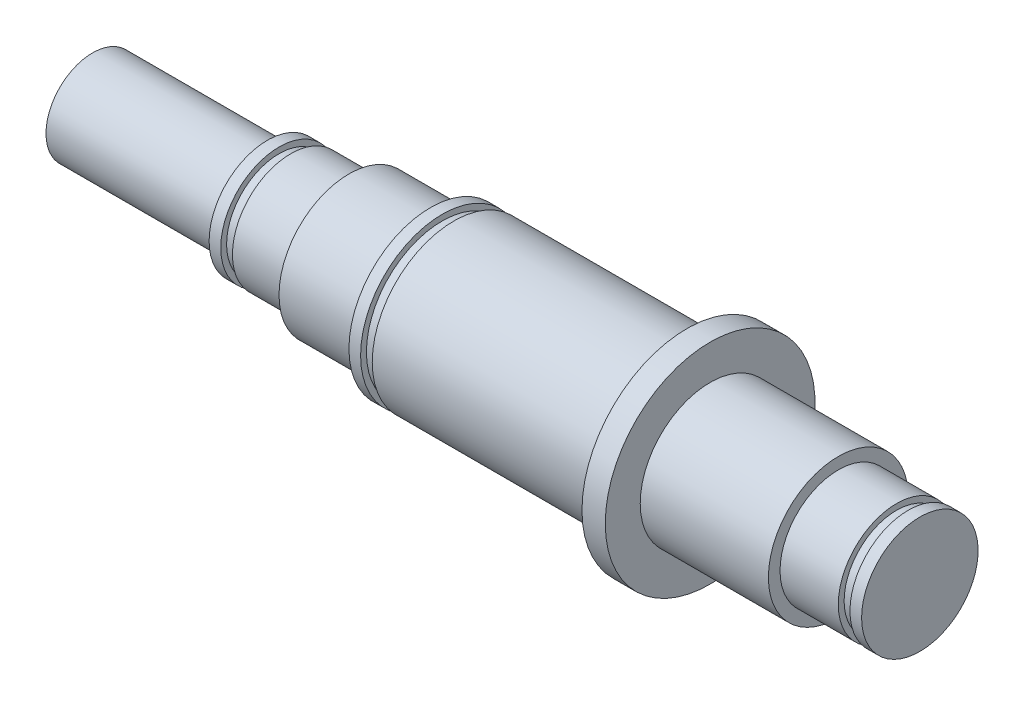
ISO-10303-21;
HEADER;
FILE_DESCRIPTION(('STEP AP214'),'2;1');
FILE_NAME('part.step','',(''),(''),'','','');
FILE_SCHEMA(('AUTOMOTIVE_DESIGN { 1 0 10303 214 1 1 1 1 }'));
ENDSEC;
DATA;
#1=APPLICATION_CONTEXT('core data for automotive mechanical design processes');
#2=APPLICATION_PROTOCOL_DEFINITION('international standard','automotive_design',2000,#1);
#3=PRODUCT_CONTEXT('',#1,'mechanical');
#4=PRODUCT('Part','Part','',(#3));
#5=PRODUCT_RELATED_PRODUCT_CATEGORY('part','',(#4));
#6=PRODUCT_DEFINITION_FORMATION('','',#4);
#7=PRODUCT_DEFINITION_CONTEXT('part definition',#1,'design');
#8=PRODUCT_DEFINITION('design','',#6,#7);
#9=PRODUCT_DEFINITION_SHAPE('','',#8);
#10=(LENGTH_UNIT() NAMED_UNIT(*) SI_UNIT(.MILLI.,.METRE.));
#11=(NAMED_UNIT(*) PLANE_ANGLE_UNIT() SI_UNIT($,.RADIAN.));
#12=(NAMED_UNIT(*) SI_UNIT($,.STERADIAN.) SOLID_ANGLE_UNIT());
#13=UNCERTAINTY_MEASURE_WITH_UNIT(LENGTH_MEASURE(1.E-05),#10,'distance_accuracy_value','');
#14=(GEOMETRIC_REPRESENTATION_CONTEXT(3) GLOBAL_UNCERTAINTY_ASSIGNED_CONTEXT((#13)) GLOBAL_UNIT_ASSIGNED_CONTEXT((#10,
#11,#12)) REPRESENTATION_CONTEXT('',''));
#15=CARTESIAN_POINT('',(0.,0.,0.));
#16=DIRECTION('',(0.,0.,1.));
#17=DIRECTION('',(1.,0.,0.));
#18=AXIS2_PLACEMENT_3D('',#15,#16,#17);
#19=CARTESIAN_POINT('',(0.,0.,0.));
#20=DIRECTION('',(1.,0.,0.));
#21=DIRECTION('',(0.,0.,-1.));
#22=AXIS2_PLACEMENT_3D('',#19,#20,#21);
#23=PLANE('',#22);
#24=CARTESIAN_POINT('',(0.,0.,0.));
#25=DIRECTION('',(-1.,0.,0.));
#26=DIRECTION('',(0.,0.,1.));
#27=AXIS2_PLACEMENT_3D('',#24,#25,#26);
#28=CIRCLE('',#27,4.);
#29=CARTESIAN_POINT('',(0.,0.,4.));
#30=VERTEX_POINT('',#29);
#31=EDGE_CURVE('E10',#30,#30,#28,.T.);
#32=ORIENTED_EDGE('',*,*,#31,.T.);
#33=EDGE_LOOP('',(#32));
#34=FACE_BOUND('',#33,.T.);
#35=ADVANCED_FACE('F32',(#34),#23,.F.);
#36=CARTESIAN_POINT('',(0.,0.,0.));
#37=DIRECTION('',(-1.,0.,0.));
#38=DIRECTION('',(0.,0.,1.));
#39=AXIS2_PLACEMENT_3D('',#36,#37,#38);
#40=CYLINDRICAL_SURFACE('',#39,4.);
#41=ORIENTED_EDGE('',*,*,#31,.F.);
#42=EDGE_LOOP('',(#41));
#43=FACE_BOUND('',#42,.T.);
#44=CARTESIAN_POINT('',(15.,0.,0.));
#45=DIRECTION('',(-1.,0.,0.));
#46=DIRECTION('',(0.,0.,1.));
#47=AXIS2_PLACEMENT_3D('',#44,#45,#46);
#48=CIRCLE('',#47,4.);
#49=CARTESIAN_POINT('',(15.,0.,4.));
#50=VERTEX_POINT('',#49);
#51=EDGE_CURVE('E38',#50,#50,#48,.T.);
#52=ORIENTED_EDGE('',*,*,#51,.T.);
#53=EDGE_LOOP('',(#52));
#54=FACE_BOUND('',#53,.T.);
#55=ADVANCED_FACE('F130',(#43,#54),#40,.T.);
#56=CARTESIAN_POINT('',(15.,4.,0.));
#57=DIRECTION('',(1.,0.,0.));
#58=DIRECTION('',(0.,0.,-1.));
#59=AXIS2_PLACEMENT_3D('',#56,#57,#58);
#60=PLANE('',#59);
#61=ORIENTED_EDGE('',*,*,#51,.F.);
#62=EDGE_LOOP('',(#61));
#63=FACE_BOUND('',#62,.T.);
#64=CARTESIAN_POINT('',(15.,0.,0.));
#65=DIRECTION('',(-1.,0.,0.));
#66=DIRECTION('',(0.,0.,1.));
#67=AXIS2_PLACEMENT_3D('',#64,#65,#66);
#68=CIRCLE('',#67,5.);
#69=CARTESIAN_POINT('',(15.,0.,5.));
#70=VERTEX_POINT('',#69);
#71=EDGE_CURVE('E42',#70,#70,#68,.T.);
#72=ORIENTED_EDGE('',*,*,#71,.T.);
#73=EDGE_LOOP('',(#72));
#74=FACE_BOUND('',#73,.T.);
#75=ADVANCED_FACE('F134',(#63,#74),#60,.F.);
#76=CARTESIAN_POINT('',(0.,0.,0.));
#77=DIRECTION('',(-1.,0.,0.));
#78=DIRECTION('',(0.,0.,1.));
#79=AXIS2_PLACEMENT_3D('',#76,#77,#78);
#80=CYLINDRICAL_SURFACE('',#79,5.);
#81=ORIENTED_EDGE('',*,*,#71,.F.);
#82=EDGE_LOOP('',(#81));
#83=FACE_BOUND('',#82,.T.);
#84=CARTESIAN_POINT('',(16.,0.,0.));
#85=DIRECTION('',(-1.,0.,0.));
#86=DIRECTION('',(0.,0.,1.));
#87=AXIS2_PLACEMENT_3D('',#84,#85,#86);
#88=CIRCLE('',#87,5.);
#89=CARTESIAN_POINT('',(16.,0.,5.));
#90=VERTEX_POINT('',#89);
#91=EDGE_CURVE('E46',#90,#90,#88,.T.);
#92=ORIENTED_EDGE('',*,*,#91,.T.);
#93=EDGE_LOOP('',(#92));
#94=FACE_BOUND('',#93,.T.);
#95=ADVANCED_FACE('F139',(#83,#94),#80,.T.);
#96=CARTESIAN_POINT('',(16.,5.,0.));
#97=DIRECTION('',(-1.,0.,0.));
#98=DIRECTION('',(0.,0.,1.));
#99=AXIS2_PLACEMENT_3D('',#96,#97,#98);
#100=PLANE('',#99);
#101=ORIENTED_EDGE('',*,*,#91,.F.);
#102=EDGE_LOOP('',(#101));
#103=FACE_BOUND('',#102,.T.);
#104=CARTESIAN_POINT('',(16.,0.,0.));
#105=DIRECTION('',(-1.,0.,0.));
#106=DIRECTION('',(0.,0.,1.));
#107=AXIS2_PLACEMENT_3D('',#104,#105,#106);
#108=CIRCLE('',#107,4.5);
#109=CARTESIAN_POINT('',(16.,0.,4.5));
#110=VERTEX_POINT('',#109);
#111=EDGE_CURVE('E51',#110,#110,#108,.T.);
#112=ORIENTED_EDGE('',*,*,#111,.T.);
#113=EDGE_LOOP('',(#112));
#114=FACE_BOUND('',#113,.T.);
#115=ADVANCED_FACE('F145',(#103,#114),#100,.F.);
#116=CARTESIAN_POINT('',(0.,0.,0.));
#117=DIRECTION('',(-1.,0.,0.));
#118=DIRECTION('',(0.,0.,1.));
#119=AXIS2_PLACEMENT_3D('',#116,#117,#118);
#120=CYLINDRICAL_SURFACE('',#119,4.5);
#121=ORIENTED_EDGE('',*,*,#111,.F.);
#122=EDGE_LOOP('',(#121));
#123=FACE_BOUND('',#122,.T.);
#124=CARTESIAN_POINT('',(17.,0.,0.));
#125=DIRECTION('',(-1.,0.,0.));
#126=DIRECTION('',(0.,0.,1.));
#127=AXIS2_PLACEMENT_3D('',#124,#125,#126);
#128=CIRCLE('',#127,4.5);
#129=CARTESIAN_POINT('',(17.,0.,4.5));
#130=VERTEX_POINT('',#129);
#131=EDGE_CURVE('E54',#130,#130,#128,.T.);
#132=ORIENTED_EDGE('',*,*,#131,.T.);
#133=EDGE_LOOP('',(#132));
#134=FACE_BOUND('',#133,.T.);
#135=ADVANCED_FACE('F149',(#123,#134),#120,.T.);
#136=CARTESIAN_POINT('',(17.,4.5,0.));
#137=DIRECTION('',(1.,0.,0.));
#138=DIRECTION('',(0.,0.,-1.));
#139=AXIS2_PLACEMENT_3D('',#136,#137,#138);
#140=PLANE('',#139);
#141=ORIENTED_EDGE('',*,*,#131,.F.);
#142=EDGE_LOOP('',(#141));
#143=FACE_BOUND('',#142,.T.);
#144=CARTESIAN_POINT('',(17.,0.,0.));
#145=DIRECTION('',(-1.,0.,0.));
#146=DIRECTION('',(0.,0.,1.));
#147=AXIS2_PLACEMENT_3D('',#144,#145,#146);
#148=CIRCLE('',#147,5.);
#149=CARTESIAN_POINT('',(17.,0.,5.));
#150=VERTEX_POINT('',#149);
#151=EDGE_CURVE('E57',#150,#150,#148,.T.);
#152=ORIENTED_EDGE('',*,*,#151,.T.);
#153=EDGE_LOOP('',(#152));
#154=FACE_BOUND('',#153,.T.);
#155=ADVANCED_FACE('F153',(#143,#154),#140,.F.);
#156=CARTESIAN_POINT('',(0.,0.,0.));
#157=DIRECTION('',(-1.,0.,0.));
#158=DIRECTION('',(0.,0.,1.));
#159=AXIS2_PLACEMENT_3D('',#156,#157,#158);
#160=CYLINDRICAL_SURFACE('',#159,5.);
#161=ORIENTED_EDGE('',*,*,#151,.F.);
#162=EDGE_LOOP('',(#161));
#163=FACE_BOUND('',#162,.T.);
#164=CARTESIAN_POINT('',(22.,0.,0.));
#165=DIRECTION('',(-1.,0.,0.));
#166=DIRECTION('',(0.,0.,1.));
#167=AXIS2_PLACEMENT_3D('',#164,#165,#166);
#168=CIRCLE('',#167,5.);
#169=CARTESIAN_POINT('',(22.,0.,5.));
#170=VERTEX_POINT('',#169);
#171=EDGE_CURVE('E60',#170,#170,#168,.T.);
#172=ORIENTED_EDGE('',*,*,#171,.T.);
#173=EDGE_LOOP('',(#172));
#174=FACE_BOUND('',#173,.T.);
#175=ADVANCED_FACE('F157',(#163,#174),#160,.T.);
#176=CARTESIAN_POINT('',(22.,5.,0.));
#177=DIRECTION('',(1.,0.,0.));
#178=DIRECTION('',(0.,0.,-1.));
#179=AXIS2_PLACEMENT_3D('',#176,#177,#178);
#180=PLANE('',#179);
#181=ORIENTED_EDGE('',*,*,#171,.F.);
#182=EDGE_LOOP('',(#181));
#183=FACE_BOUND('',#182,.T.);
#184=CARTESIAN_POINT('',(22.,0.,0.));
#185=DIRECTION('',(-1.,0.,0.));
#186=DIRECTION('',(0.,0.,1.));
#187=AXIS2_PLACEMENT_3D('',#184,#185,#186);
#188=CIRCLE('',#187,6.);
#189=CARTESIAN_POINT('',(22.,0.,6.));
#190=VERTEX_POINT('',#189);
#191=EDGE_CURVE('E63',#190,#190,#188,.T.);
#192=ORIENTED_EDGE('',*,*,#191,.T.);
#193=EDGE_LOOP('',(#192));
#194=FACE_BOUND('',#193,.T.);
#195=ADVANCED_FACE('F161',(#183,#194),#180,.F.);
#196=CARTESIAN_POINT('',(0.,0.,0.));
#197=DIRECTION('',(-1.,0.,0.));
#198=DIRECTION('',(0.,0.,1.));
#199=AXIS2_PLACEMENT_3D('',#196,#197,#198);
#200=CYLINDRICAL_SURFACE('',#199,6.);
#201=ORIENTED_EDGE('',*,*,#191,.F.);
#202=EDGE_LOOP('',(#201));
#203=FACE_BOUND('',#202,.T.);
#204=CARTESIAN_POINT('',(29.,0.,0.));
#205=DIRECTION('',(-1.,0.,0.));
#206=DIRECTION('',(0.,0.,1.));
#207=AXIS2_PLACEMENT_3D('',#204,#205,#206);
#208=CIRCLE('',#207,6.);
#209=CARTESIAN_POINT('',(29.,0.,6.));
#210=VERTEX_POINT('',#209);
#211=EDGE_CURVE('E66',#210,#210,#208,.T.);
#212=ORIENTED_EDGE('',*,*,#211,.T.);
#213=EDGE_LOOP('',(#212));
#214=FACE_BOUND('',#213,.T.);
#215=ADVANCED_FACE('F165',(#203,#214),#200,.T.);
#216=CARTESIAN_POINT('',(29.,6.,0.));
#217=DIRECTION('',(1.,0.,0.));
#218=DIRECTION('',(0.,0.,-1.));
#219=AXIS2_PLACEMENT_3D('',#216,#217,#218);
#220=PLANE('',#219);
#221=ORIENTED_EDGE('',*,*,#211,.F.);
#222=EDGE_LOOP('',(#221));
#223=FACE_BOUND('',#222,.T.);
#224=CARTESIAN_POINT('',(29.,0.,0.));
#225=DIRECTION('',(-1.,0.,0.));
#226=DIRECTION('',(0.,0.,1.));
#227=AXIS2_PLACEMENT_3D('',#224,#225,#226);
#228=CIRCLE('',#227,7.);
#229=CARTESIAN_POINT('',(29.,0.,7.));
#230=VERTEX_POINT('',#229);
#231=EDGE_CURVE('E69',#230,#230,#228,.T.);
#232=ORIENTED_EDGE('',*,*,#231,.T.);
#233=EDGE_LOOP('',(#232));
#234=FACE_BOUND('',#233,.T.);
#235=ADVANCED_FACE('F169',(#223,#234),#220,.F.);
#236=CARTESIAN_POINT('',(0.,0.,0.));
#237=DIRECTION('',(-1.,0.,0.));
#238=DIRECTION('',(0.,0.,1.));
#239=AXIS2_PLACEMENT_3D('',#236,#237,#238);
#240=CYLINDRICAL_SURFACE('',#239,7.);
#241=ORIENTED_EDGE('',*,*,#231,.F.);
#242=EDGE_LOOP('',(#241));
#243=FACE_BOUND('',#242,.T.);
#244=CARTESIAN_POINT('',(30.,0.,0.));
#245=DIRECTION('',(-1.,0.,0.));
#246=DIRECTION('',(0.,0.,1.));
#247=AXIS2_PLACEMENT_3D('',#244,#245,#246);
#248=CIRCLE('',#247,7.);
#249=CARTESIAN_POINT('',(30.,0.,7.));
#250=VERTEX_POINT('',#249);
#251=EDGE_CURVE('E72',#250,#250,#248,.T.);
#252=ORIENTED_EDGE('',*,*,#251,.T.);
#253=EDGE_LOOP('',(#252));
#254=FACE_BOUND('',#253,.T.);
#255=ADVANCED_FACE('F173',(#243,#254),#240,.T.);
#256=CARTESIAN_POINT('',(30.,7.,0.));
#257=DIRECTION('',(-1.,0.,0.));
#258=DIRECTION('',(0.,0.,1.));
#259=AXIS2_PLACEMENT_3D('',#256,#257,#258);
#260=PLANE('',#259);
#261=ORIENTED_EDGE('',*,*,#251,.F.);
#262=EDGE_LOOP('',(#261));
#263=FACE_BOUND('',#262,.T.);
#264=CARTESIAN_POINT('',(30.,0.,0.));
#265=DIRECTION('',(-1.,0.,0.));
#266=DIRECTION('',(0.,0.,1.));
#267=AXIS2_PLACEMENT_3D('',#264,#265,#266);
#268=CIRCLE('',#267,6.5);
#269=CARTESIAN_POINT('',(30.,0.,6.5));
#270=VERTEX_POINT('',#269);
#271=EDGE_CURVE('E75',#270,#270,#268,.T.);
#272=ORIENTED_EDGE('',*,*,#271,.T.);
#273=EDGE_LOOP('',(#272));
#274=FACE_BOUND('',#273,.T.);
#275=ADVANCED_FACE('F177',(#263,#274),#260,.F.);
#276=CARTESIAN_POINT('',(0.,0.,0.));
#277=DIRECTION('',(-1.,0.,0.));
#278=DIRECTION('',(0.,0.,1.));
#279=AXIS2_PLACEMENT_3D('',#276,#277,#278);
#280=CYLINDRICAL_SURFACE('',#279,6.5);
#281=ORIENTED_EDGE('',*,*,#271,.F.);
#282=EDGE_LOOP('',(#281));
#283=FACE_BOUND('',#282,.T.);
#284=CARTESIAN_POINT('',(31.,0.,0.));
#285=DIRECTION('',(-1.,0.,0.));
#286=DIRECTION('',(0.,0.,1.));
#287=AXIS2_PLACEMENT_3D('',#284,#285,#286);
#288=CIRCLE('',#287,6.5);
#289=CARTESIAN_POINT('',(31.,0.,6.5));
#290=VERTEX_POINT('',#289);
#291=EDGE_CURVE('E78',#290,#290,#288,.T.);
#292=ORIENTED_EDGE('',*,*,#291,.T.);
#293=EDGE_LOOP('',(#292));
#294=FACE_BOUND('',#293,.T.);
#295=ADVANCED_FACE('F181',(#283,#294),#280,.T.);
#296=CARTESIAN_POINT('',(31.,6.5,0.));
#297=DIRECTION('',(1.,0.,0.));
#298=DIRECTION('',(0.,0.,-1.));
#299=AXIS2_PLACEMENT_3D('',#296,#297,#298);
#300=PLANE('',#299);
#301=ORIENTED_EDGE('',*,*,#291,.F.);
#302=EDGE_LOOP('',(#301));
#303=FACE_BOUND('',#302,.T.);
#304=CARTESIAN_POINT('',(31.,0.,0.));
#305=DIRECTION('',(-1.,0.,0.));
#306=DIRECTION('',(0.,0.,1.));
#307=AXIS2_PLACEMENT_3D('',#304,#305,#306);
#308=CIRCLE('',#307,7.);
#309=CARTESIAN_POINT('',(31.,0.,7.));
#310=VERTEX_POINT('',#309);
#311=EDGE_CURVE('E81',#310,#310,#308,.T.);
#312=ORIENTED_EDGE('',*,*,#311,.T.);
#313=EDGE_LOOP('',(#312));
#314=FACE_BOUND('',#313,.T.);
#315=ADVANCED_FACE('F185',(#303,#314),#300,.F.);
#316=CARTESIAN_POINT('',(0.,0.,0.));
#317=DIRECTION('',(-1.,0.,0.));
#318=DIRECTION('',(0.,0.,1.));
#319=AXIS2_PLACEMENT_3D('',#316,#317,#318);
#320=CYLINDRICAL_SURFACE('',#319,7.);
#321=ORIENTED_EDGE('',*,*,#311,.F.);
#322=EDGE_LOOP('',(#321));
#323=FACE_BOUND('',#322,.T.);
#324=CARTESIAN_POINT('',(51.,0.,0.));
#325=DIRECTION('',(-1.,0.,0.));
#326=DIRECTION('',(0.,0.,1.));
#327=AXIS2_PLACEMENT_3D('',#324,#325,#326);
#328=CIRCLE('',#327,7.);
#329=CARTESIAN_POINT('',(51.,0.,7.));
#330=VERTEX_POINT('',#329);
#331=EDGE_CURVE('E84',#330,#330,#328,.T.);
#332=ORIENTED_EDGE('',*,*,#331,.T.);
#333=EDGE_LOOP('',(#332));
#334=FACE_BOUND('',#333,.T.);
#335=ADVANCED_FACE('F189',(#323,#334),#320,.T.);
#336=CARTESIAN_POINT('',(51.,7.,0.));
#337=DIRECTION('',(1.,0.,0.));
#338=DIRECTION('',(0.,0.,-1.));
#339=AXIS2_PLACEMENT_3D('',#336,#337,#338);
#340=PLANE('',#339);
#341=ORIENTED_EDGE('',*,*,#331,.F.);
#342=EDGE_LOOP('',(#341));
#343=FACE_BOUND('',#342,.T.);
#344=CARTESIAN_POINT('',(51.,0.,0.));
#345=DIRECTION('',(-1.,0.,0.));
#346=DIRECTION('',(0.,0.,1.));
#347=AXIS2_PLACEMENT_3D('',#344,#345,#346);
#348=CIRCLE('',#347,9.);
#349=CARTESIAN_POINT('',(51.,0.,9.));
#350=VERTEX_POINT('',#349);
#351=EDGE_CURVE('E87',#350,#350,#348,.T.);
#352=ORIENTED_EDGE('',*,*,#351,.T.);
#353=EDGE_LOOP('',(#352));
#354=FACE_BOUND('',#353,.T.);
#355=ADVANCED_FACE('F193',(#343,#354),#340,.F.);
#356=CARTESIAN_POINT('',(0.,0.,0.));
#357=DIRECTION('',(-1.,0.,0.));
#358=DIRECTION('',(0.,0.,1.));
#359=AXIS2_PLACEMENT_3D('',#356,#357,#358);
#360=CYLINDRICAL_SURFACE('',#359,9.);
#361=ORIENTED_EDGE('',*,*,#351,.F.);
#362=EDGE_LOOP('',(#361));
#363=FACE_BOUND('',#362,.T.);
#364=CARTESIAN_POINT('',(53.,0.,0.));
#365=DIRECTION('',(-1.,0.,0.));
#366=DIRECTION('',(0.,0.,1.));
#367=AXIS2_PLACEMENT_3D('',#364,#365,#366);
#368=CIRCLE('',#367,9.);
#369=CARTESIAN_POINT('',(53.,0.,9.));
#370=VERTEX_POINT('',#369);
#371=EDGE_CURVE('E90',#370,#370,#368,.T.);
#372=ORIENTED_EDGE('',*,*,#371,.T.);
#373=EDGE_LOOP('',(#372));
#374=FACE_BOUND('',#373,.T.);
#375=ADVANCED_FACE('F197',(#363,#374),#360,.T.);
#376=CARTESIAN_POINT('',(53.,9.,0.));
#377=DIRECTION('',(-1.,0.,0.));
#378=DIRECTION('',(0.,0.,1.));
#379=AXIS2_PLACEMENT_3D('',#376,#377,#378);
#380=PLANE('',#379);
#381=ORIENTED_EDGE('',*,*,#371,.F.);
#382=EDGE_LOOP('',(#381));
#383=FACE_BOUND('',#382,.T.);
#384=CARTESIAN_POINT('',(53.,0.,0.));
#385=DIRECTION('',(-1.,0.,0.));
#386=DIRECTION('',(0.,0.,1.));
#387=AXIS2_PLACEMENT_3D('',#384,#385,#386);
#388=CIRCLE('',#387,6.);
#389=CARTESIAN_POINT('',(53.,0.,6.));
#390=VERTEX_POINT('',#389);
#391=EDGE_CURVE('E93',#390,#390,#388,.T.);
#392=ORIENTED_EDGE('',*,*,#391,.T.);
#393=EDGE_LOOP('',(#392));
#394=FACE_BOUND('',#393,.T.);
#395=ADVANCED_FACE('F201',(#383,#394),#380,.F.);
#396=CARTESIAN_POINT('',(0.,0.,0.));
#397=DIRECTION('',(-1.,0.,0.));
#398=DIRECTION('',(0.,0.,1.));
#399=AXIS2_PLACEMENT_3D('',#396,#397,#398);
#400=CYLINDRICAL_SURFACE('',#399,6.);
#401=ORIENTED_EDGE('',*,*,#391,.F.);
#402=EDGE_LOOP('',(#401));
#403=FACE_BOUND('',#402,.T.);
#404=CARTESIAN_POINT('',(64.,0.,0.));
#405=DIRECTION('',(-1.,0.,0.));
#406=DIRECTION('',(0.,0.,1.));
#407=AXIS2_PLACEMENT_3D('',#404,#405,#406);
#408=CIRCLE('',#407,6.);
#409=CARTESIAN_POINT('',(64.,0.,6.));
#410=VERTEX_POINT('',#409);
#411=EDGE_CURVE('E96',#410,#410,#408,.T.);
#412=ORIENTED_EDGE('',*,*,#411,.T.);
#413=EDGE_LOOP('',(#412));
#414=FACE_BOUND('',#413,.T.);
#415=ADVANCED_FACE('F205',(#403,#414),#400,.T.);
#416=CARTESIAN_POINT('',(64.,6.,0.));
#417=DIRECTION('',(-1.,0.,0.));
#418=DIRECTION('',(0.,0.,1.));
#419=AXIS2_PLACEMENT_3D('',#416,#417,#418);
#420=PLANE('',#419);
#421=ORIENTED_EDGE('',*,*,#411,.F.);
#422=EDGE_LOOP('',(#421));
#423=FACE_BOUND('',#422,.T.);
#424=CARTESIAN_POINT('',(64.,0.,0.));
#425=DIRECTION('',(-1.,0.,0.));
#426=DIRECTION('',(0.,0.,1.));
#427=AXIS2_PLACEMENT_3D('',#424,#425,#426);
#428=CIRCLE('',#427,5.);
#429=CARTESIAN_POINT('',(64.,0.,5.));
#430=VERTEX_POINT('',#429);
#431=EDGE_CURVE('E99',#430,#430,#428,.T.);
#432=ORIENTED_EDGE('',*,*,#431,.T.);
#433=EDGE_LOOP('',(#432));
#434=FACE_BOUND('',#433,.T.);
#435=ADVANCED_FACE('F209',(#423,#434),#420,.F.);
#436=CARTESIAN_POINT('',(0.,0.,0.));
#437=DIRECTION('',(-1.,0.,0.));
#438=DIRECTION('',(0.,0.,1.));
#439=AXIS2_PLACEMENT_3D('',#436,#437,#438);
#440=CYLINDRICAL_SURFACE('',#439,5.);
#441=ORIENTED_EDGE('',*,*,#431,.F.);
#442=EDGE_LOOP('',(#441));
#443=FACE_BOUND('',#442,.T.);
#444=CARTESIAN_POINT('',(69.,0.,0.));
#445=DIRECTION('',(-1.,0.,0.));
#446=DIRECTION('',(0.,0.,1.));
#447=AXIS2_PLACEMENT_3D('',#444,#445,#446);
#448=CIRCLE('',#447,5.);
#449=CARTESIAN_POINT('',(69.,0.,5.));
#450=VERTEX_POINT('',#449);
#451=EDGE_CURVE('E102',#450,#450,#448,.T.);
#452=ORIENTED_EDGE('',*,*,#451,.T.);
#453=EDGE_LOOP('',(#452));
#454=FACE_BOUND('',#453,.T.);
#455=ADVANCED_FACE('F213',(#443,#454),#440,.T.);
#456=CARTESIAN_POINT('',(69.,5.,0.));
#457=DIRECTION('',(-1.,0.,0.));
#458=DIRECTION('',(0.,0.,1.));
#459=AXIS2_PLACEMENT_3D('',#456,#457,#458);
#460=PLANE('',#459);
#461=ORIENTED_EDGE('',*,*,#451,.F.);
#462=EDGE_LOOP('',(#461));
#463=FACE_BOUND('',#462,.T.);
#464=CARTESIAN_POINT('',(69.,0.,0.));
#465=DIRECTION('',(-1.,0.,0.));
#466=DIRECTION('',(0.,0.,1.));
#467=AXIS2_PLACEMENT_3D('',#464,#465,#466);
#468=CIRCLE('',#467,4.5);
#469=CARTESIAN_POINT('',(69.,0.,4.5));
#470=VERTEX_POINT('',#469);
#471=EDGE_CURVE('E105',#470,#470,#468,.T.);
#472=ORIENTED_EDGE('',*,*,#471,.T.);
#473=EDGE_LOOP('',(#472));
#474=FACE_BOUND('',#473,.T.);
#475=ADVANCED_FACE('F217',(#463,#474),#460,.F.);
#476=CARTESIAN_POINT('',(0.,0.,0.));
#477=DIRECTION('',(-1.,0.,0.));
#478=DIRECTION('',(0.,0.,1.));
#479=AXIS2_PLACEMENT_3D('',#476,#477,#478);
#480=CYLINDRICAL_SURFACE('',#479,4.5);
#481=ORIENTED_EDGE('',*,*,#471,.F.);
#482=EDGE_LOOP('',(#481));
#483=FACE_BOUND('',#482,.T.);
#484=CARTESIAN_POINT('',(70.,0.,0.));
#485=DIRECTION('',(-1.,0.,0.));
#486=DIRECTION('',(0.,0.,1.));
#487=AXIS2_PLACEMENT_3D('',#484,#485,#486);
#488=CIRCLE('',#487,4.5);
#489=CARTESIAN_POINT('',(70.,0.,4.5));
#490=VERTEX_POINT('',#489);
#491=EDGE_CURVE('E108',#490,#490,#488,.T.);
#492=ORIENTED_EDGE('',*,*,#491,.T.);
#493=EDGE_LOOP('',(#492));
#494=FACE_BOUND('',#493,.T.);
#495=ADVANCED_FACE('F221',(#483,#494),#480,.T.);
#496=CARTESIAN_POINT('',(70.,4.5,0.));
#497=DIRECTION('',(1.,0.,0.));
#498=DIRECTION('',(0.,0.,-1.));
#499=AXIS2_PLACEMENT_3D('',#496,#497,#498);
#500=PLANE('',#499);
#501=ORIENTED_EDGE('',*,*,#491,.F.);
#502=EDGE_LOOP('',(#501));
#503=FACE_BOUND('',#502,.T.);
#504=CARTESIAN_POINT('',(70.,0.,0.));
#505=DIRECTION('',(-1.,0.,0.));
#506=DIRECTION('',(0.,0.,1.));
#507=AXIS2_PLACEMENT_3D('',#504,#505,#506);
#508=CIRCLE('',#507,5.);
#509=CARTESIAN_POINT('',(70.,0.,5.));
#510=VERTEX_POINT('',#509);
#511=EDGE_CURVE('E111',#510,#510,#508,.T.);
#512=ORIENTED_EDGE('',*,*,#511,.T.);
#513=EDGE_LOOP('',(#512));
#514=FACE_BOUND('',#513,.T.);
#515=ADVANCED_FACE('F126',(#503,#514),#500,.F.);
#516=CARTESIAN_POINT('',(0.,0.,0.));
#517=DIRECTION('',(-1.,0.,0.));
#518=DIRECTION('',(0.,0.,1.));
#519=AXIS2_PLACEMENT_3D('',#516,#517,#518);
#520=CYLINDRICAL_SURFACE('',#519,5.);
#521=ORIENTED_EDGE('',*,*,#511,.F.);
#522=EDGE_LOOP('',(#521));
#523=FACE_BOUND('',#522,.T.);
#524=CARTESIAN_POINT('',(71.,0.,0.));
#525=DIRECTION('',(-1.,0.,0.));
#526=DIRECTION('',(0.,0.,1.));
#527=AXIS2_PLACEMENT_3D('',#524,#525,#526);
#528=CIRCLE('',#527,5.);
#529=CARTESIAN_POINT('',(71.,0.,5.));
#530=VERTEX_POINT('',#529);
#531=EDGE_CURVE('E114',#530,#530,#528,.T.);
#532=ORIENTED_EDGE('',*,*,#531,.T.);
#533=EDGE_LOOP('',(#532));
#534=FACE_BOUND('',#533,.T.);
#535=ADVANCED_FACE('F118',(#523,#534),#520,.T.);
#536=CARTESIAN_POINT('',(71.,5.,0.));
#537=DIRECTION('',(-1.,0.,0.));
#538=DIRECTION('',(0.,0.,1.));
#539=AXIS2_PLACEMENT_3D('',#536,#537,#538);
#540=PLANE('',#539);
#541=ORIENTED_EDGE('',*,*,#531,.F.);
#542=EDGE_LOOP('',(#541));
#543=FACE_BOUND('',#542,.T.);
#544=ADVANCED_FACE('F120',(#543),#540,.F.);
#545=CLOSED_SHELL('',(#35,#55,#75,#95,#115,#135,#155,#175,#195,#215,#235,#255,#275,#295,#315,
#335,#355,#375,#395,#415,#435,#455,#475,#495,#515,#535,#544));
#546=MANIFOLD_SOLID_BREP('B2',#545);
#547=ADVANCED_BREP_SHAPE_REPRESENTATION('',(#18,#546),#14);
#548=SHAPE_DEFINITION_REPRESENTATION(#9,#547);
ENDSEC;
END-ISO-10303-21;
